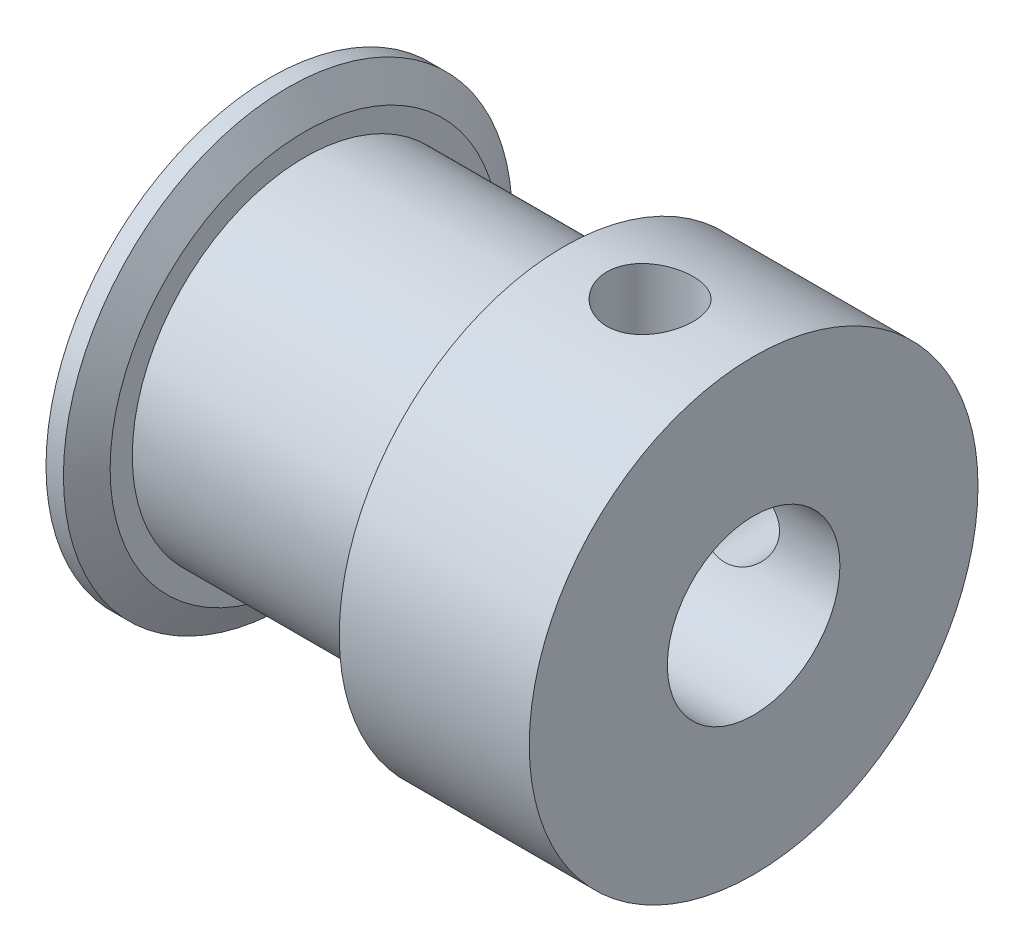
ISO-10303-21;
HEADER;
FILE_DESCRIPTION(('STEP AP214'),'2;1');
FILE_NAME('part.step','',(''),(''),'','','');
FILE_SCHEMA(('AUTOMOTIVE_DESIGN { 1 0 10303 214 1 1 1 1 }'));
ENDSEC;
DATA;
#1=APPLICATION_CONTEXT('core data for automotive mechanical design processes');
#2=APPLICATION_PROTOCOL_DEFINITION('international standard','automotive_design',2000,#1);
#3=PRODUCT_CONTEXT('',#1,'mechanical');
#4=PRODUCT('Part','Part','',(#3));
#5=PRODUCT_RELATED_PRODUCT_CATEGORY('part','',(#4));
#6=PRODUCT_DEFINITION_FORMATION('','',#4);
#7=PRODUCT_DEFINITION_CONTEXT('part definition',#1,'design');
#8=PRODUCT_DEFINITION('design','',#6,#7);
#9=PRODUCT_DEFINITION_SHAPE('','',#8);
#10=(LENGTH_UNIT() NAMED_UNIT(*) SI_UNIT(.MILLI.,.METRE.));
#11=(NAMED_UNIT(*) PLANE_ANGLE_UNIT() SI_UNIT($,.RADIAN.));
#12=(NAMED_UNIT(*) SI_UNIT($,.STERADIAN.) SOLID_ANGLE_UNIT());
#13=UNCERTAINTY_MEASURE_WITH_UNIT(LENGTH_MEASURE(1.E-05),#10,'distance_accuracy_value','');
#14=(GEOMETRIC_REPRESENTATION_CONTEXT(3) GLOBAL_UNCERTAINTY_ASSIGNED_CONTEXT((#13)) GLOBAL_UNIT_ASSIGNED_CONTEXT((#10,
#11,#12)) REPRESENTATION_CONTEXT('',''));
#15=CARTESIAN_POINT('',(0.,0.,0.));
#16=DIRECTION('',(0.,0.,1.));
#17=DIRECTION('',(1.,0.,0.));
#18=AXIS2_PLACEMENT_3D('',#15,#16,#17);
#19=CARTESIAN_POINT('',(0.,0.,-6.5));
#20=DIRECTION('',(1.,0.,0.));
#21=DIRECTION('',(0.,0.,-1.));
#22=AXIS2_PLACEMENT_3D('',#19,#20,#21);
#23=PLANE('',#22);
#24=CARTESIAN_POINT('',(0.,0.,0.));
#25=DIRECTION('',(-1.,0.,0.));
#26=DIRECTION('',(0.,0.,1.));
#27=AXIS2_PLACEMENT_3D('',#24,#25,#26);
#28=CIRCLE('',#27,2.5);
#29=CARTESIAN_POINT('',(0.,0.,2.5));
#30=VERTEX_POINT('',#29);
#31=EDGE_CURVE('E10',#30,#30,#28,.T.);
#32=ORIENTED_EDGE('',*,*,#31,.F.);
#33=EDGE_LOOP('',(#32));
#34=FACE_BOUND('',#33,.T.);
#35=CARTESIAN_POINT('',(0.,0.,0.));
#36=DIRECTION('',(-1.,0.,0.));
#37=DIRECTION('',(0.,0.,1.));
#38=AXIS2_PLACEMENT_3D('',#35,#36,#37);
#39=CIRCLE('',#38,6.5);
#40=CARTESIAN_POINT('',(0.,0.,6.5));
#41=VERTEX_POINT('',#40);
#42=EDGE_CURVE('E68',#41,#41,#39,.T.);
#43=ORIENTED_EDGE('',*,*,#42,.T.);
#44=EDGE_LOOP('',(#43));
#45=FACE_BOUND('',#44,.T.);
#46=ADVANCED_FACE('F34',(#34,#45),#23,.F.);
#47=CARTESIAN_POINT('',(-10.793334545725,0.,0.));
#48=DIRECTION('',(-1.,0.,0.));
#49=DIRECTION('',(0.,0.,1.));
#50=AXIS2_PLACEMENT_3D('',#47,#48,#49);
#51=CYLINDRICAL_SURFACE('',#50,2.5);
#52=CARTESIAN_POINT('',(11.,1.24999999999999,-2.1650635094611));
#53=CARTESIAN_POINT('',(11.0651347602441,1.24999545384315,-2.16506918410575));
#54=CARTESIAN_POINT('',(11.1303517644063,1.24487496341651,-2.16804751484696));
#55=CARTESIAN_POINT('',(11.2587840808464,1.22465401237255,-2.17952958065066));
#56=CARTESIAN_POINT('',(11.3219948938043,1.20953258069271,-2.1880449256945));
#57=CARTESIAN_POINT('',(11.4443145804299,1.17012493587475,-2.20936683256749));
#58=CARTESIAN_POINT('',(11.503443315592,1.14588744061715,-2.22215054341566));
#59=CARTESIAN_POINT('',(11.6167802524959,1.08908440672045,-2.25053331021073));
#60=CARTESIAN_POINT('',(11.6709881878281,1.0565184175447,-2.26613251845081));
#61=CARTESIAN_POINT('',(11.7778821606969,0.980833175663585,-2.29996086321802));
#62=CARTESIAN_POINT('',(11.8300739195919,0.9370650451797,-2.31830079547442));
#63=CARTESIAN_POINT('',(11.9267604855084,0.841567259518073,-2.35464978482132));
#64=CARTESIAN_POINT('',(11.9712514532294,0.789833657227853,-2.37265867289063));
#65=CARTESIAN_POINT('',(12.0542089389346,0.67561195426817,-2.40776846191187));
#66=CARTESIAN_POINT('',(12.0920672098244,0.612633986265706,-2.42472633022716));
#67=CARTESIAN_POINT('',(12.1564260665572,0.480196283249368,-2.45438445124411));
#68=CARTESIAN_POINT('',(12.1829338201715,0.410740672672683,-2.46708738979677));
#69=CARTESIAN_POINT('',(12.2218808266264,0.272556179907461,-2.48600576555297));
#70=CARTESIAN_POINT('',(12.2351869079444,0.204127238111012,-2.49261850276115));
#71=CARTESIAN_POINT('',(12.2502076483438,0.0657132858723012,-2.50009479807584));
#72=CARTESIAN_POINT('',(12.2519293209946,-0.00427075730468185,-2.50096183480737));
#73=CARTESIAN_POINT('',(12.2440666575371,-0.137290655529696,-2.49703727395563));
#74=CARTESIAN_POINT('',(12.2354524805985,-0.200401498970997,-2.492731198652));
#75=CARTESIAN_POINT('',(12.2088989451192,-0.32414221489791,-2.47967806574684));
#76=CARTESIAN_POINT('',(12.1909588887797,-0.384771901367414,-2.47093067582992));
#77=CARTESIAN_POINT('',(12.1461467923877,-0.502886739461948,-2.44964479109568));
#78=CARTESIAN_POINT('',(12.1191546085349,-0.560316779393979,-2.43705551911499));
#79=CARTESIAN_POINT('',(12.0571707297481,-0.669971001891666,-2.40922057483359));
#80=CARTESIAN_POINT('',(12.0221761708721,-0.722193311048312,-2.39397395196855));
#81=CARTESIAN_POINT('',(11.9413808105837,-0.825217076122748,-2.36055492999036));
#82=CARTESIAN_POINT('',(11.8948712145925,-0.875417593786705,-2.34224219997719));
#83=CARTESIAN_POINT('',(11.7942628438373,-0.967630462872229,-2.30567925733514));
#84=CARTESIAN_POINT('',(11.7401582846574,-1.00963651446779,-2.28742910332036));
#85=CARTESIAN_POINT('',(11.6216897594699,-1.08688166830277,-2.25180195115606));
#86=CARTESIAN_POINT('',(11.5568924711822,-1.12152164372257,-2.23455399988384));
#87=CARTESIAN_POINT('',(11.4213279108012,-1.17914889125154,-2.2046931284822));
#88=CARTESIAN_POINT('',(11.350566958728,-1.20214832276361,-2.19207537557584));
#89=CARTESIAN_POINT('',(11.2109818608965,-1.2339752637813,-2.17430794771293));
#90=CARTESIAN_POINT('',(11.1424486011956,-1.24378140264997,-2.1686456981062));
#91=CARTESIAN_POINT('',(11.0044983231043,-1.25189618326428,-2.16397399202012));
#92=CARTESIAN_POINT('',(10.9350819636003,-1.25021294664378,-2.16495983611639));
#93=CARTESIAN_POINT('',(10.8054326017766,-1.23629505417996,-2.17292920675731));
#94=CARTESIAN_POINT('',(10.7450256861151,-1.22523477089058,-2.17924484383318));
#95=CARTESIAN_POINT('',(10.6270402671613,-1.19462035579055,-2.19617526939176));
#96=CARTESIAN_POINT('',(10.5694626865667,-1.17506347327952,-2.20679145006292));
#97=CARTESIAN_POINT('',(10.4557358363716,-1.12705948575611,-2.23170277599571));
#98=CARTESIAN_POINT('',(10.3997762289331,-1.09824257961591,-2.24614554053829));
#99=CARTESIAN_POINT('',(10.2931634105763,-1.03285883001976,-2.27695149371562));
#100=CARTESIAN_POINT('',(10.2425129456084,-0.996288005415271,-2.29331566693934));
#101=CARTESIAN_POINT('',(10.1412765405956,-0.911046458998568,-2.3285999807042));
#102=CARTESIAN_POINT('',(10.0915035616029,-0.86143159039371,-2.34758228942861));
#103=CARTESIAN_POINT('',(10.000734702508,-0.754255619247864,-2.38417793722365));
#104=CARTESIAN_POINT('',(9.95974178721183,-0.696691843319187,-2.40179081259636));
#105=CARTESIAN_POINT('',(9.88678284256238,-0.573169203198451,-2.43426702113696));
#106=CARTESIAN_POINT('',(9.85508360223637,-0.507028871967646,-2.44904552090036));
#107=CARTESIAN_POINT('',(9.80357762017826,-0.369402955801357,-2.47354193699126));
#108=CARTESIAN_POINT('',(9.78376043579212,-0.297922126740225,-2.48326429595466));
#109=CARTESIAN_POINT('',(9.75828929478168,-0.158724602913027,-2.49584385227353));
#110=CARTESIAN_POINT('',(9.75150265515486,-0.0912643048130772,-2.49924909885239));
#111=CARTESIAN_POINT('',(9.748945918182,0.0439074824389978,-2.50052662968914));
#112=CARTESIAN_POINT('',(9.75317196434555,0.111618875368852,-2.49840085083612));
#113=CARTESIAN_POINT('',(9.77177050849454,0.240672490396426,-2.48917461047403));
#114=CARTESIAN_POINT('',(9.7854560615721,0.302140397264072,-2.48241118334987));
#115=CARTESIAN_POINT('',(9.82165874912872,0.421807440229514,-2.46490117079279));
#116=CARTESIAN_POINT('',(9.84417715011682,0.480006106194378,-2.45415401415995));
#117=CARTESIAN_POINT('',(9.89840881520747,0.594279257806097,-2.4290741343515));
#118=CARTESIAN_POINT('',(9.9304741540098,0.650156428375048,-2.41460771498499));
#119=CARTESIAN_POINT('',(10.0024474135738,0.75596830226752,-2.38360166427283));
#120=CARTESIAN_POINT('',(10.0423589363946,0.805900259268624,-2.36706108197951));
#121=CARTESIAN_POINT('',(10.1334964237784,0.903642505196104,-2.33160762783285));
#122=CARTESIAN_POINT('',(10.1854531093465,0.950747105674079,-2.31262248764623));
#123=CARTESIAN_POINT('',(10.2968134014122,1.03582910924333,-2.27578845203566));
#124=CARTESIAN_POINT('',(10.3562235260846,1.07379843751256,-2.25794057202332));
#125=CARTESIAN_POINT('',(10.4832958082262,1.14053884973206,-2.22499506631146));
#126=CARTESIAN_POINT('',(10.5511594139109,1.16898133245116,-2.21000217820338));
#127=CARTESIAN_POINT('',(10.6916655054247,1.213598386883,-2.1858269541044));
#128=CARTESIAN_POINT('',(10.7642911111409,1.22981398896917,-2.17662520184628));
#129=CARTESIAN_POINT('',(10.864756694565,1.2429587598305,-2.16911590752239));
#130=CARTESIAN_POINT('',(10.8917098679974,1.2455951312048,-2.1676016125644));
#131=CARTESIAN_POINT('',(10.9457706008528,1.24911675636244,-2.16557419859688));
#132=CARTESIAN_POINT('',(10.9728781704823,1.25000189299983,-2.16506114656387));
#133=CARTESIAN_POINT('',(11.,1.24999999999999,-2.1650635094611));
#134=B_SPLINE_CURVE_WITH_KNOTS('',3,(#52,#53,#54,#55,#56,#57,#58,#59,#60,#61,#62,#63,#64,#65,
#66,#67,#68,#69,#70,#71,#72,#73,#74,#75,#76,#77,#78,#79,#80,#81,#82,#83,#84,#85,#86,#87,#88,#89,
#90,#91,#92,#93,#94,#95,#96,#97,#98,#99,#100,#101,#102,#103,#104,#105,#106,#107,#108,#109,#110,
#111,#112,#113,#114,#115,#116,#117,#118,#119,#120,#121,#122,#123,#124,#125,#126,#127,#128,#129,
#130,#131,#132,#133),.UNSPECIFIED.,.T.,.F.,(4,2,2,2,2,2,2,2,2,2,2,2,2,2,2,2,2,2,2,2,2,2,2,2,2,2,
2,2,2,2,2,2,2,2,2,2,2,2,2,2,4),(0.,0.195290153243394,0.390991116031004,0.585660744898603,
0.780340906806433,0.991077890622786,1.20191963855463,1.42697365298454,1.65188533704863,
1.86079356209918,2.06957529607549,2.26020121855672,2.45084140646818,2.64411918413932,
2.83746624187838,3.04908989321112,3.26087560307397,3.48611052161809,3.71110967764629,
3.91827863567763,4.12530116485464,4.3096772928003,4.49411315545077,4.68709120507607,
4.88016857775057,5.09758429475764,5.3150733122275,5.53830226766204,5.76133474760961,
5.96390337986855,6.16640108492461,6.35555531089362,6.54473666890013,6.74200938399336,
6.93937287625895,7.15637802312581,7.37357428556439,7.59763436298252,7.82093916253446,
7.90225168981632,7.98356965618171),.UNSPECIFIED.);
#135=CARTESIAN_POINT('',(11.,1.24999999999999,-2.1650635094611));
#136=VERTEX_POINT('',#135);
#137=EDGE_CURVE('E154',#136,#136,#134,.T.);
#138=ORIENTED_EDGE('',*,*,#137,.T.);
#139=EDGE_LOOP('',(#138));
#140=FACE_BOUND('',#139,.T.);
#141=CARTESIAN_POINT('',(11.,2.1650635094611,1.24999999999999));
#142=CARTESIAN_POINT('',(11.0651347602441,2.16506918410574,1.24999545384316));
#143=CARTESIAN_POINT('',(11.1303517644063,2.16804751484696,1.24487496341651));
#144=CARTESIAN_POINT('',(11.2587840808464,2.17952958065066,1.22465401237256));
#145=CARTESIAN_POINT('',(11.3219948938043,2.1880449256945,1.20953258069272));
#146=CARTESIAN_POINT('',(11.4443145804299,2.20936683256748,1.17012493587476));
#147=CARTESIAN_POINT('',(11.503443315592,2.22215054341565,1.14588744061716));
#148=CARTESIAN_POINT('',(11.6167802524959,2.25053331021073,1.08908440672046));
#149=CARTESIAN_POINT('',(11.6709881878281,2.26613251845081,1.05651841754471));
#150=CARTESIAN_POINT('',(11.7778821606969,2.29996086321802,0.980833175663593));
#151=CARTESIAN_POINT('',(11.8300739195919,2.31830079547442,0.937065045179708));
#152=CARTESIAN_POINT('',(11.9267604855084,2.35464978482132,0.841567259518081));
#153=CARTESIAN_POINT('',(11.9712514532294,2.37265867289062,0.789833657227862));
#154=CARTESIAN_POINT('',(12.0542089389346,2.40776846191186,0.675611954268179));
#155=CARTESIAN_POINT('',(12.0920672098244,2.42472633022716,0.612633986265716));
#156=CARTESIAN_POINT('',(12.1564260665572,2.45438445124411,0.480196283249379));
#157=CARTESIAN_POINT('',(12.1829338201715,2.46708738979677,0.410740672672693));
#158=CARTESIAN_POINT('',(12.2218808266264,2.48600576555297,0.272556179907471));
#159=CARTESIAN_POINT('',(12.2351869079444,2.49261850276115,0.204127238111022));
#160=CARTESIAN_POINT('',(12.2502076483438,2.50009479807584,0.0657132858723103));
#161=CARTESIAN_POINT('',(12.2519293209946,2.50096183480737,-0.00427075730467276));
#162=CARTESIAN_POINT('',(12.2440666575371,2.49703727395563,-0.137290655529687));
#163=CARTESIAN_POINT('',(12.2354524805985,2.492731198652,-0.200401498970988));
#164=CARTESIAN_POINT('',(12.2088989451192,2.47967806574684,-0.324142214897901));
#165=CARTESIAN_POINT('',(12.1909588887797,2.47093067582992,-0.384771901367405));
#166=CARTESIAN_POINT('',(12.1461467923877,2.44964479109568,-0.50288673946194));
#167=CARTESIAN_POINT('',(12.1191546085349,2.43705551911499,-0.560316779393971));
#168=CARTESIAN_POINT('',(12.0571707297481,2.40922057483359,-0.669971001891658));
#169=CARTESIAN_POINT('',(12.0221761708721,2.39397395196855,-0.722193311048304));
#170=CARTESIAN_POINT('',(11.9413808105837,2.36055492999037,-0.825217076122739));
#171=CARTESIAN_POINT('',(11.8948712145925,2.34224219997719,-0.875417593786696));
#172=CARTESIAN_POINT('',(11.7942628438373,2.30567925733515,-0.96763046287222));
#173=CARTESIAN_POINT('',(11.7401582846574,2.28742910332036,-1.00963651446778));
#174=CARTESIAN_POINT('',(11.6216897594699,2.25180195115606,-1.08688166830276));
#175=CARTESIAN_POINT('',(11.5568924711822,2.23455399988385,-1.12152164372256));
#176=CARTESIAN_POINT('',(11.4213279108012,2.2046931284822,-1.17914889125153));
#177=CARTESIAN_POINT('',(11.350566958728,2.19207537557585,-1.20214832276361));
#178=CARTESIAN_POINT('',(11.2109818608965,2.17430794771293,-1.23397526378129));
#179=CARTESIAN_POINT('',(11.1424486011956,2.16864569810621,-1.24378140264996));
#180=CARTESIAN_POINT('',(11.0044983231043,2.16397399202012,-1.25189618326427));
#181=CARTESIAN_POINT('',(10.9350819636003,2.1649598361164,-1.25021294664377));
#182=CARTESIAN_POINT('',(10.8054326017766,2.17292920675731,-1.23629505417995));
#183=CARTESIAN_POINT('',(10.7450256861151,2.17924484383318,-1.22523477089058));
#184=CARTESIAN_POINT('',(10.6270402671613,2.19617526939177,-1.19462035579054));
#185=CARTESIAN_POINT('',(10.5694626865667,2.20679145006293,-1.17506347327951));
#186=CARTESIAN_POINT('',(10.4557358363716,2.23170277599571,-1.1270594857561));
#187=CARTESIAN_POINT('',(10.3997762289331,2.24614554053829,-1.0982425796159));
#188=CARTESIAN_POINT('',(10.2931634105763,2.27695149371562,-1.03285883001975));
#189=CARTESIAN_POINT('',(10.2425129456084,2.29331566693935,-0.996288005415262));
#190=CARTESIAN_POINT('',(10.1412765405956,2.3285999807042,-0.911046458998559));
#191=CARTESIAN_POINT('',(10.0915035616029,2.34758228942862,-0.861431590393701));
#192=CARTESIAN_POINT('',(10.000734702508,2.38417793722366,-0.754255619247854));
#193=CARTESIAN_POINT('',(9.95974178721183,2.40179081259637,-0.696691843319177));
#194=CARTESIAN_POINT('',(9.88678284256238,2.43426702113696,-0.57316920319844));
#195=CARTESIAN_POINT('',(9.85508360223637,2.44904552090037,-0.507028871967635));
#196=CARTESIAN_POINT('',(9.80357762017826,2.47354193699126,-0.369402955801347));
#197=CARTESIAN_POINT('',(9.78376043579213,2.48326429595466,-0.297922126740215));
#198=CARTESIAN_POINT('',(9.75828929478168,2.49584385227353,-0.158724602913017));
#199=CARTESIAN_POINT('',(9.75150265515486,2.49924909885239,-0.091264304813067));
#200=CARTESIAN_POINT('',(9.74894591818201,2.50052662968914,0.0439074824390078));
#201=CARTESIAN_POINT('',(9.75317196434555,2.49840085083612,0.111618875368861));
#202=CARTESIAN_POINT('',(9.77177050849454,2.48917461047403,0.240672490396436));
#203=CARTESIAN_POINT('',(9.7854560615721,2.48241118334987,0.302140397264081));
#204=CARTESIAN_POINT('',(9.82165874912872,2.46490117079279,0.421807440229523));
#205=CARTESIAN_POINT('',(9.84417715011682,2.45415401415995,0.480006106194386));
#206=CARTESIAN_POINT('',(9.89840881520747,2.4290741343515,0.594279257806105));
#207=CARTESIAN_POINT('',(9.9304741540098,2.41460771498499,0.650156428375057));
#208=CARTESIAN_POINT('',(10.0024474135738,2.38360166427283,0.755968302267529));
#209=CARTESIAN_POINT('',(10.0423589363946,2.36706108197951,0.805900259268632));
#210=CARTESIAN_POINT('',(10.1334964237784,2.33160762783285,0.903642505196112));
#211=CARTESIAN_POINT('',(10.1854531093465,2.31262248764622,0.950747105674087));
#212=CARTESIAN_POINT('',(10.2968134014122,2.27578845203565,1.03582910924334));
#213=CARTESIAN_POINT('',(10.3562235260846,2.25794057202332,1.07379843751257));
#214=CARTESIAN_POINT('',(10.4832958082262,2.22499506631145,1.14053884973206));
#215=CARTESIAN_POINT('',(10.5511594139109,2.21000217820338,1.16898133245117));
#216=CARTESIAN_POINT('',(10.6916655054247,2.1858269541044,1.21359838688301));
#217=CARTESIAN_POINT('',(10.7642911111409,2.17662520184628,1.22981398896918));
#218=CARTESIAN_POINT('',(10.864756694565,2.16911590752238,1.24295875983051));
#219=CARTESIAN_POINT('',(10.8917098679974,2.1676016125644,1.24559513120481));
#220=CARTESIAN_POINT('',(10.9457706008528,2.16557419859688,1.24911675636245));
#221=CARTESIAN_POINT('',(10.9728781704823,2.16506114656387,1.25000189299983));
#222=CARTESIAN_POINT('',(11.,2.1650635094611,1.24999999999999));
#223=B_SPLINE_CURVE_WITH_KNOTS('',3,(#141,#142,#143,#144,#145,#146,#147,#148,#149,#150,#151,
#152,#153,#154,#155,#156,#157,#158,#159,#160,#161,#162,#163,#164,#165,#166,#167,#168,#169,#170,
#171,#172,#173,#174,#175,#176,#177,#178,#179,#180,#181,#182,#183,#184,#185,#186,#187,#188,#189,
#190,#191,#192,#193,#194,#195,#196,#197,#198,#199,#200,#201,#202,#203,#204,#205,#206,#207,#208,
#209,#210,#211,#212,#213,#214,#215,#216,#217,#218,#219,#220,#221,#222),.UNSPECIFIED.,.T.,.F.,(4,
2,2,2,2,2,2,2,2,2,2,2,2,2,2,2,2,2,2,2,2,2,2,2,2,2,2,2,2,2,2,2,2,2,2,2,2,2,2,2,4),(0.,
0.195290153243394,0.390991116031004,0.585660744898607,0.780340906806433,0.991077890622786,
1.20191963855463,1.42697365298453,1.65188533704863,1.86079356209918,2.06957529607549,
2.26020121855672,2.45084140646818,2.64411918413932,2.83746624187838,3.04908989321112,
3.26087560307396,3.48611052161809,3.71110967764629,3.91827863567763,4.12530116485464,
4.3096772928003,4.49411315545076,4.68709120507607,4.88016857775057,5.09758429475764,
5.3150733122275,5.53830226766204,5.76133474760961,5.96390337986855,6.16640108492461,
6.35555531089362,6.54473666890013,6.74200938399336,6.93937287625895,7.1563780231258,
7.37357428556439,7.59763436298252,7.82093916253446,7.90225168981632,7.98356965618171),.UNSPECIFIED.);
#224=CARTESIAN_POINT('',(11.,2.1650635094611,1.24999999999999));
#225=VERTEX_POINT('',#224);
#226=EDGE_CURVE('E79',#225,#225,#223,.T.);
#227=ORIENTED_EDGE('',*,*,#226,.T.);
#228=EDGE_LOOP('',(#227));
#229=FACE_BOUND('',#228,.T.);
#230=CARTESIAN_POINT('',(14.,0.,0.));
#231=DIRECTION('',(-1.,0.,0.));
#232=DIRECTION('',(0.,0.,1.));
#233=AXIS2_PLACEMENT_3D('',#230,#231,#232);
#234=CIRCLE('',#233,2.5);
#235=CARTESIAN_POINT('',(14.,0.,2.5));
#236=VERTEX_POINT('',#235);
#237=EDGE_CURVE('E40',#236,#236,#234,.T.);
#238=ORIENTED_EDGE('',*,*,#237,.F.);
#239=EDGE_LOOP('',(#238));
#240=FACE_BOUND('',#239,.T.);
#241=ORIENTED_EDGE('',*,*,#31,.T.);
#242=EDGE_LOOP('',(#241));
#243=FACE_BOUND('',#242,.T.);
#244=ADVANCED_FACE('F130',(#140,#229,#240,#243),#51,.F.);
#245=CARTESIAN_POINT('',(14.,0.,-6.5));
#246=DIRECTION('',(-1.,0.,0.));
#247=DIRECTION('',(0.,0.,1.));
#248=AXIS2_PLACEMENT_3D('',#245,#246,#247);
#249=PLANE('',#248);
#250=CARTESIAN_POINT('',(14.,0.,0.));
#251=DIRECTION('',(-1.,0.,0.));
#252=DIRECTION('',(0.,0.,1.));
#253=AXIS2_PLACEMENT_3D('',#250,#251,#252);
#254=CIRCLE('',#253,6.5);
#255=CARTESIAN_POINT('',(14.,0.,6.5));
#256=VERTEX_POINT('',#255);
#257=EDGE_CURVE('E44',#256,#256,#254,.T.);
#258=ORIENTED_EDGE('',*,*,#257,.F.);
#259=EDGE_LOOP('',(#258));
#260=FACE_BOUND('',#259,.T.);
#261=ORIENTED_EDGE('',*,*,#237,.T.);
#262=EDGE_LOOP('',(#261));
#263=FACE_BOUND('',#262,.T.);
#264=ADVANCED_FACE('F125',(#260,#263),#249,.F.);
#265=CARTESIAN_POINT('',(-10.793334545725,0.,0.));
#266=DIRECTION('',(-1.,0.,0.));
#267=DIRECTION('',(0.,0.,1.));
#268=AXIS2_PLACEMENT_3D('',#265,#266,#267);
#269=CYLINDRICAL_SURFACE('',#268,6.5);
#270=CARTESIAN_POINT('',(11.,1.24999999999997,-6.37867541108654));
#271=CARTESIAN_POINT('',(10.9304870701299,1.24999736885639,-6.37867677250477));
#272=CARTESIAN_POINT('',(10.8609403849395,1.24418186230498,-6.37982405427988));
#273=CARTESIAN_POINT('',(10.723810470586,1.22109056860368,-6.38428311706258));
#274=CARTESIAN_POINT('',(10.6562289199764,1.2038052680602,-6.38759669482778));
#275=CARTESIAN_POINT('',(10.5250331776187,1.15832687331586,-6.39599950317928));
#276=CARTESIAN_POINT('',(10.461415263085,1.13014419926352,-6.40108703704062));
#277=CARTESIAN_POINT('',(10.3398137250332,1.0636990177658,-6.41246250789304));
#278=CARTESIAN_POINT('',(10.2818297096666,1.02543721203106,-6.41875036130931));
#279=CARTESIAN_POINT('',(10.1723793937811,0.939386229111957,-6.43190989333671));
#280=CARTESIAN_POINT('',(10.1209975252457,0.891490559318406,-6.43878755510874));
#281=CARTESIAN_POINT('',(10.0269462349264,0.787761561290316,-6.45229899014005));
#282=CARTESIAN_POINT('',(9.98427739952779,0.731927699245843,-6.45893274695996));
#283=CARTESIAN_POINT('',(9.90853829487112,0.613350935538086,-6.47127318847283));
#284=CARTESIAN_POINT('',(9.87554787064748,0.550556144435054,-6.4769719992949));
#285=CARTESIAN_POINT('',(9.82061678733642,0.420187239305355,-6.48673338477553));
#286=CARTESIAN_POINT('',(9.79867517244009,0.352613539268875,-6.49079610096305));
#287=CARTESIAN_POINT('',(9.76672629824719,0.215480422586701,-6.49678527544986));
#288=CARTESIAN_POINT('',(9.75657661243997,0.145955319062528,-6.49873720804986));
#289=CARTESIAN_POINT('',(9.74805570838894,0.00616353547045933,-6.50037275588565));
#290=CARTESIAN_POINT('',(9.74968343733201,-0.0641030777512762,-6.500056573874));
#291=CARTESIAN_POINT('',(9.76456238130295,-0.202405790144951,-6.49721136164987));
#292=CARTESIAN_POINT('',(9.77766021656545,-0.27045907804485,-6.49471153255982));
#293=CARTESIAN_POINT('',(9.81486472715625,-0.40338352482687,-6.48781272689527));
#294=CARTESIAN_POINT('',(9.83897181885584,-0.468254563253192,-6.48341367849242));
#295=CARTESIAN_POINT('',(9.89765514107206,-0.593415183621947,-6.47316216290495));
#296=CARTESIAN_POINT('',(9.93229222264249,-0.653675517596723,-6.46730128437235));
#297=CARTESIAN_POINT('',(10.0110073969698,-0.767585734089813,-6.45477348931642));
#298=CARTESIAN_POINT('',(10.0550864976628,-0.821234909902577,-6.44810648677241));
#299=CARTESIAN_POINT('',(10.1522782545843,-0.92130923472024,-6.43457726746675));
#300=CARTESIAN_POINT('',(10.2055251171175,-0.967603944931744,-6.42771363640452));
#301=CARTESIAN_POINT('',(10.3190950873362,-1.05062658176581,-6.41466719987934));
#302=CARTESIAN_POINT('',(10.3794183094764,-1.08735435361945,-6.40848440543154));
#303=CARTESIAN_POINT('',(10.5056070086356,-1.15024066625938,-6.39749734332417));
#304=CARTESIAN_POINT('',(10.5714825775618,-1.1763794373028,-6.39269565900801));
#305=CARTESIAN_POINT('',(10.7068037771895,-1.21718055037066,-6.3850533836003));
#306=CARTESIAN_POINT('',(10.7762489795482,-1.23184426594896,-6.38221255780053));
#307=CARTESIAN_POINT('',(10.9155596623143,-1.24908687610469,-6.37886030689755));
#308=CARTESIAN_POINT('',(10.9854010568419,-1.25185353492833,-6.37831269303331));
#309=CARTESIAN_POINT('',(11.1245476819348,-1.24572754981922,-6.37951191542097));
#310=CARTESIAN_POINT('',(11.1938529402843,-1.23683551420127,-6.38125863196178));
#311=CARTESIAN_POINT('',(11.3293374715962,-1.20780600299424,-6.38681592650116));
#312=CARTESIAN_POINT('',(11.3955388020833,-1.18776767337308,-6.39060829956574));
#313=CARTESIAN_POINT('',(11.5236444237273,-1.13711989327066,-6.39981381261965));
#314=CARTESIAN_POINT('',(11.5855483835179,-1.10650962868253,-6.40522707742377));
#315=CARTESIAN_POINT('',(11.7041271211925,-1.03515742955886,-6.41714642685596));
#316=CARTESIAN_POINT('',(11.7607295072189,-0.994297306141371,-6.42366494996723));
#317=CARTESIAN_POINT('',(11.866342559433,-0.90376393894118,-6.43702568121476));
#318=CARTESIAN_POINT('',(11.9153525050736,-0.854089859644106,-6.44386791999234));
#319=CARTESIAN_POINT('',(12.0050948760167,-0.746498406265088,-6.45722186414506));
#320=CARTESIAN_POINT('',(12.0457007660287,-0.68847462176834,-6.46372754443459));
#321=CARTESIAN_POINT('',(12.1165876530475,-0.566319701133056,-6.47557271520352));
#322=CARTESIAN_POINT('',(12.1468690616983,-0.502188808619503,-6.48091225217478));
#323=CARTESIAN_POINT('',(12.1960598649178,-0.369983306850273,-6.48979767344294));
#324=CARTESIAN_POINT('',(12.2150304053231,-0.301932124206317,-6.49335318520434));
#325=CARTESIAN_POINT('',(12.2412555973101,-0.163534387521089,-6.49831110108714));
#326=CARTESIAN_POINT('',(12.2485115486984,-0.0931880890209875,-6.4997137440819));
#327=CARTESIAN_POINT('',(12.2510544157463,0.0465913760590636,-6.50020279357526));
#328=CARTESIAN_POINT('',(12.2465321111651,0.116021014310155,-6.49932611998711));
#329=CARTESIAN_POINT('',(12.2260659599172,0.253111453624531,-6.49543210097589));
#330=CARTESIAN_POINT('',(12.2101222352329,0.320772273571049,-6.49241477841525));
#331=CARTESIAN_POINT('',(12.1673479038059,0.452296774627162,-6.48457887372446));
#332=CARTESIAN_POINT('',(12.140538595824,0.516167605689429,-6.47976381696689));
#333=CARTESIAN_POINT('',(12.0768174427467,0.638532441229185,-6.468852626646));
#334=CARTESIAN_POINT('',(12.039904874214,0.697026060274173,-6.46275640135273));
#335=CARTESIAN_POINT('',(11.9563732748342,0.807923978838708,-6.44983924026474));
#336=CARTESIAN_POINT('',(11.9096169139576,0.86022374245002,-6.44300880304229));
#337=CARTESIAN_POINT('',(11.808008908723,0.956300833059333,-6.42945166376516));
#338=CARTESIAN_POINT('',(11.7531553586733,1.00007614816925,-6.42272498654338));
#339=CARTESIAN_POINT('',(11.6362650805111,1.07826726211676,-6.41006461317975));
#340=CARTESIAN_POINT('',(11.5741631204958,1.11258695800965,-6.40413935016888));
#341=CARTESIAN_POINT('',(11.4449796130776,1.1702507721629,-6.39385470831481));
#342=CARTESIAN_POINT('',(11.3779027648172,1.19360509889591,-6.38949387392551));
#343=CARTESIAN_POINT('',(11.2588708126346,1.22401068110329,-6.38372654797567));
#344=CARTESIAN_POINT('',(11.2076060062007,1.23373969739609,-6.38184380422201));
#345=CARTESIAN_POINT('',(11.1042337768284,1.24673524699075,-6.37931774381065));
#346=CARTESIAN_POINT('',(11.0521263790688,1.2500019730428,-6.37867439018579));
#347=CARTESIAN_POINT('',(11.,1.24999999999997,-6.37867541108654));
#348=B_SPLINE_CURVE_WITH_KNOTS('',3,(#270,#271,#272,#273,#274,#275,#276,#277,#278,#279,#280,
#281,#282,#283,#284,#285,#286,#287,#288,#289,#290,#291,#292,#293,#294,#295,#296,#297,#298,#299,
#300,#301,#302,#303,#304,#305,#306,#307,#308,#309,#310,#311,#312,#313,#314,#315,#316,#317,#318,
#319,#320,#321,#322,#323,#324,#325,#326,#327,#328,#329,#330,#331,#332,#333,#334,#335,#336,#337,
#338,#339,#340,#341,#342,#343,#344,#345,#346,#347),.UNSPECIFIED.,.T.,.F.,(4,2,2,2,2,2,2,2,2,2,2,
2,2,2,2,2,2,2,2,2,2,2,2,2,2,2,2,2,2,2,2,2,2,2,2,2,2,2,4),(0.,0.208347994425063,
0.416869015339831,0.625191138043341,0.833498761161481,1.04424985912791,1.25501513592546,
1.46747321088402,1.67991290338877,1.88975909537703,2.09958652891118,2.30665024511141,
2.51372179313299,2.72201348359887,2.9303274203089,3.14200045966174,3.35367692313737,
3.56574678669523,3.77779126179575,3.98647658946276,4.19515102900507,4.4019983304366,
4.60886156399132,4.8182295460239,5.02761738559909,5.23995929713471,5.45229274146443,
5.66346766485099,5.87461915545402,6.08237184297276,6.29012231169611,6.49746750164922,
6.70482754230234,6.91529891011168,7.12581989203799,7.33840759539414,7.55079699078512,
7.70703771468343,7.86327377833242),.UNSPECIFIED.);
#349=CARTESIAN_POINT('',(11.,1.24999999999997,-6.37867541108654));
#350=VERTEX_POINT('',#349);
#351=EDGE_CURVE('E158',#350,#350,#348,.T.);
#352=ORIENTED_EDGE('',*,*,#351,.T.);
#353=EDGE_LOOP('',(#352));
#354=FACE_BOUND('',#353,.T.);
#355=CARTESIAN_POINT('',(11.,6.37867541108654,1.24999999999999));
#356=CARTESIAN_POINT('',(10.9304870701299,6.37867677250476,1.24999736885641));
#357=CARTESIAN_POINT('',(10.8609403849395,6.37982405427988,1.244181862305));
#358=CARTESIAN_POINT('',(10.723810470586,6.38428311706257,1.2210905686037));
#359=CARTESIAN_POINT('',(10.6562289199764,6.38759669482778,1.20380526806022));
#360=CARTESIAN_POINT('',(10.5250331776187,6.39599950317928,1.15832687331588));
#361=CARTESIAN_POINT('',(10.461415263085,6.40108703704062,1.13014419926354));
#362=CARTESIAN_POINT('',(10.3398137250332,6.41246250789304,1.06369901776582));
#363=CARTESIAN_POINT('',(10.2818297096666,6.41875036130931,1.02543721203108));
#364=CARTESIAN_POINT('',(10.1723793937811,6.43190989333671,0.93938622911198));
#365=CARTESIAN_POINT('',(10.1209975252457,6.43878755510874,0.891490559318429));
#366=CARTESIAN_POINT('',(10.0269462349264,6.45229899014005,0.78776156129034));
#367=CARTESIAN_POINT('',(9.9842773995278,6.45893274695996,0.731927699245867));
#368=CARTESIAN_POINT('',(9.90853829487112,6.47127318847283,0.61335093553811));
#369=CARTESIAN_POINT('',(9.87554787064748,6.4769719992949,0.550556144435078));
#370=CARTESIAN_POINT('',(9.82061678733643,6.48673338477552,0.42018723930538));
#371=CARTESIAN_POINT('',(9.79867517244009,6.49079610096305,0.352613539268899));
#372=CARTESIAN_POINT('',(9.7667262982472,6.49678527544986,0.215480422586725));
#373=CARTESIAN_POINT('',(9.75657661243998,6.49873720804986,0.145955319062553));
#374=CARTESIAN_POINT('',(9.74805570838894,6.50037275588565,0.00616353547048378));
#375=CARTESIAN_POINT('',(9.749683437332,6.500056573874,-0.0641030777512518));
#376=CARTESIAN_POINT('',(9.76456238130295,6.49721136164987,-0.202405790144926));
#377=CARTESIAN_POINT('',(9.77766021656545,6.49471153255983,-0.270459078044826));
#378=CARTESIAN_POINT('',(9.81486472715625,6.48781272689528,-0.403383524826845));
#379=CARTESIAN_POINT('',(9.83897181885584,6.48341367849243,-0.468254563253168));
#380=CARTESIAN_POINT('',(9.89765514107206,6.47316216290495,-0.593415183621923));
#381=CARTESIAN_POINT('',(9.93229222264249,6.46730128437235,-0.653675517596699));
#382=CARTESIAN_POINT('',(10.0110073969698,6.45477348931643,-0.767585734089789));
#383=CARTESIAN_POINT('',(10.0550864976628,6.44810648677241,-0.821234909902552));
#384=CARTESIAN_POINT('',(10.1522782545843,6.43457726746675,-0.921309234720216));
#385=CARTESIAN_POINT('',(10.2055251171175,6.42771363640452,-0.967603944931721));
#386=CARTESIAN_POINT('',(10.3190950873362,6.41466719987934,-1.05062658176578));
#387=CARTESIAN_POINT('',(10.3794183094764,6.40848440543154,-1.08735435361943));
#388=CARTESIAN_POINT('',(10.5056070086356,6.39749734332418,-1.15024066625936));
#389=CARTESIAN_POINT('',(10.5714825775618,6.39269565900802,-1.17637943730278));
#390=CARTESIAN_POINT('',(10.7068037771895,6.3850533836003,-1.21718055037064));
#391=CARTESIAN_POINT('',(10.7762489795482,6.38221255780053,-1.23184426594894));
#392=CARTESIAN_POINT('',(10.9155596623143,6.37886030689755,-1.24908687610467));
#393=CARTESIAN_POINT('',(10.9854010568419,6.37831269303331,-1.25185353492831));
#394=CARTESIAN_POINT('',(11.1245476819348,6.37951191542098,-1.2457275498192));
#395=CARTESIAN_POINT('',(11.1938529402843,6.38125863196178,-1.23683551420124));
#396=CARTESIAN_POINT('',(11.3293374715962,6.38681592650117,-1.20780600299422));
#397=CARTESIAN_POINT('',(11.3955388020833,6.39060829956575,-1.18776767337306));
#398=CARTESIAN_POINT('',(11.5236444237273,6.39981381261965,-1.13711989327064));
#399=CARTESIAN_POINT('',(11.5855483835179,6.40522707742377,-1.1065096286825));
#400=CARTESIAN_POINT('',(11.7041271211925,6.41714642685596,-1.03515742955883));
#401=CARTESIAN_POINT('',(11.7607295072189,6.42366494996723,-0.994297306141348));
#402=CARTESIAN_POINT('',(11.866342559433,6.43702568121476,-0.903763938941158));
#403=CARTESIAN_POINT('',(11.9153525050736,6.44386791999234,-0.854089859644083));
#404=CARTESIAN_POINT('',(12.0050948760167,6.45722186414506,-0.746498406265066));
#405=CARTESIAN_POINT('',(12.0457007660287,6.4637275444346,-0.688474621768318));
#406=CARTESIAN_POINT('',(12.1165876530475,6.47557271520352,-0.566319701133033));
#407=CARTESIAN_POINT('',(12.1468690616983,6.48091225217478,-0.50218880861948));
#408=CARTESIAN_POINT('',(12.1960598649178,6.48979767344294,-0.36998330685025));
#409=CARTESIAN_POINT('',(12.2150304053231,6.49335318520434,-0.301932124206295));
#410=CARTESIAN_POINT('',(12.2412555973101,6.49831110108714,-0.163534387521067));
#411=CARTESIAN_POINT('',(12.2485115486984,6.4997137440819,-0.0931880890209663));
#412=CARTESIAN_POINT('',(12.2510544157463,6.50020279357526,0.0465913760590845));
#413=CARTESIAN_POINT('',(12.2465321111651,6.49932611998711,0.116021014310175));
#414=CARTESIAN_POINT('',(12.2260659599172,6.49543210097589,0.253111453624551));
#415=CARTESIAN_POINT('',(12.2101222352329,6.49241477841525,0.320772273571069));
#416=CARTESIAN_POINT('',(12.1673479038059,6.48457887372446,0.452296774627182));
#417=CARTESIAN_POINT('',(12.140538595824,6.47976381696689,0.516167605689451));
#418=CARTESIAN_POINT('',(12.0768174427467,6.468852626646,0.638532441229207));
#419=CARTESIAN_POINT('',(12.039904874214,6.46275640135272,0.697026060274194));
#420=CARTESIAN_POINT('',(11.9563732748342,6.44983924026474,0.807923978838729));
#421=CARTESIAN_POINT('',(11.9096169139576,6.44300880304229,0.860223742450042));
#422=CARTESIAN_POINT('',(11.808008908723,6.42945166376516,0.956300833059354));
#423=CARTESIAN_POINT('',(11.7531553586733,6.42272498654338,1.00007614816927));
#424=CARTESIAN_POINT('',(11.6362650805111,6.41006461317974,1.07826726211679));
#425=CARTESIAN_POINT('',(11.5741631204959,6.40413935016887,1.11258695800967));
#426=CARTESIAN_POINT('',(11.4449796130776,6.39385470831481,1.17025077216292));
#427=CARTESIAN_POINT('',(11.3779027648172,6.38949387392551,1.19360509889593));
#428=CARTESIAN_POINT('',(11.2588708126346,6.38372654797567,1.22401068110331));
#429=CARTESIAN_POINT('',(11.2076060062007,6.381843804222,1.23373969739611));
#430=CARTESIAN_POINT('',(11.1042337768284,6.37931774381065,1.24673524699077));
#431=CARTESIAN_POINT('',(11.0521263790688,6.37867439018579,1.25000197304282));
#432=CARTESIAN_POINT('',(11.,6.37867541108654,1.24999999999999));
#433=B_SPLINE_CURVE_WITH_KNOTS('',3,(#355,#356,#357,#358,#359,#360,#361,#362,#363,#364,#365,
#366,#367,#368,#369,#370,#371,#372,#373,#374,#375,#376,#377,#378,#379,#380,#381,#382,#383,#384,
#385,#386,#387,#388,#389,#390,#391,#392,#393,#394,#395,#396,#397,#398,#399,#400,#401,#402,#403,
#404,#405,#406,#407,#408,#409,#410,#411,#412,#413,#414,#415,#416,#417,#418,#419,#420,#421,#422,
#423,#424,#425,#426,#427,#428,#429,#430,#431,#432),.UNSPECIFIED.,.T.,.F.,(4,2,2,2,2,2,2,2,2,2,2,
2,2,2,2,2,2,2,2,2,2,2,2,2,2,2,2,2,2,2,2,2,2,2,2,2,2,2,4),(0.,0.208347994425063,0.41686901533983,
0.625191138043341,0.833498761161478,1.04424985912791,1.25501513592545,1.46747321088401,
1.67991290338877,1.88975909537703,2.09958652891117,2.3066502451114,2.51372179313299,
2.72201348359886,2.93032742030889,3.14200045966174,3.35367692313736,3.56574678669523,
3.77779126179575,3.98647658946276,4.19515102900506,4.40199833043659,4.60886156399132,
4.8182295460239,5.02761738559908,5.2399592971347,5.45229274146443,5.66346766485098,
5.87461915545401,6.08237184297275,6.2901223116961,6.49746750164921,6.70482754230233,
6.91529891011167,7.12581989203798,7.33840759539413,7.5507969907851,7.70703771468342,
7.86327377833241),.UNSPECIFIED.);
#434=CARTESIAN_POINT('',(11.,6.37867541108654,1.24999999999999));
#435=VERTEX_POINT('',#434);
#436=EDGE_CURVE('E71',#435,#435,#433,.T.);
#437=ORIENTED_EDGE('',*,*,#436,.T.);
#438=EDGE_LOOP('',(#437));
#439=FACE_BOUND('',#438,.T.);
#440=CARTESIAN_POINT('',(8.49532543403975,0.,0.));
#441=DIRECTION('',(-1.,0.,0.));
#442=DIRECTION('',(0.,0.,1.));
#443=AXIS2_PLACEMENT_3D('',#440,#441,#442);
#444=CIRCLE('',#443,6.5);
#445=CARTESIAN_POINT('',(8.49532543403975,0.,6.5));
#446=VERTEX_POINT('',#445);
#447=EDGE_CURVE('E48',#446,#446,#444,.T.);
#448=ORIENTED_EDGE('',*,*,#447,.F.);
#449=EDGE_LOOP('',(#448));
#450=FACE_BOUND('',#449,.T.);
#451=ORIENTED_EDGE('',*,*,#257,.T.);
#452=EDGE_LOOP('',(#451));
#453=FACE_BOUND('',#452,.T.);
#454=ADVANCED_FACE('F85',(#354,#439,#450,#453),#269,.T.);
#455=CARTESIAN_POINT('',(8.49532543403975,0.,0.));
#456=DIRECTION('',(1.,0.,0.));
#457=DIRECTION('',(0.,0.,-1.));
#458=AXIS2_PLACEMENT_3D('',#455,#456,#457);
#459=CONICAL_SURFACE('',#458,6.5,1.0471975511966);
#460=CARTESIAN_POINT('',(8.,0.,0.));
#461=DIRECTION('',(-1.,0.,0.));
#462=DIRECTION('',(0.,0.,1.));
#463=AXIS2_PLACEMENT_3D('',#460,#461,#462);
#464=CIRCLE('',#463,5.64207118196205);
#465=CARTESIAN_POINT('',(8.,0.,5.64207118196205));
#466=VERTEX_POINT('',#465);
#467=EDGE_CURVE('E53',#466,#466,#464,.T.);
#468=ORIENTED_EDGE('',*,*,#467,.F.);
#469=EDGE_LOOP('',(#468));
#470=FACE_BOUND('',#469,.T.);
#471=ORIENTED_EDGE('',*,*,#447,.T.);
#472=EDGE_LOOP('',(#471));
#473=FACE_BOUND('',#472,.T.);
#474=ADVANCED_FACE('F118',(#470,#473),#459,.T.);
#475=CARTESIAN_POINT('',(8.,0.,-5.));
#476=DIRECTION('',(1.,0.,0.));
#477=DIRECTION('',(0.,0.,-1.));
#478=AXIS2_PLACEMENT_3D('',#475,#476,#477);
#479=PLANE('',#478);
#480=CARTESIAN_POINT('',(8.,0.,0.));
#481=DIRECTION('',(-1.,0.,0.));
#482=DIRECTION('',(0.,0.,1.));
#483=AXIS2_PLACEMENT_3D('',#480,#481,#482);
#484=CIRCLE('',#483,5.);
#485=CARTESIAN_POINT('',(8.,0.,5.));
#486=VERTEX_POINT('',#485);
#487=EDGE_CURVE('E56',#486,#486,#484,.T.);
#488=ORIENTED_EDGE('',*,*,#487,.F.);
#489=EDGE_LOOP('',(#488));
#490=FACE_BOUND('',#489,.T.);
#491=ORIENTED_EDGE('',*,*,#467,.T.);
#492=EDGE_LOOP('',(#491));
#493=FACE_BOUND('',#492,.T.);
#494=ADVANCED_FACE('F115',(#490,#493),#479,.F.);
#495=CARTESIAN_POINT('',(-10.793334545725,0.,0.));
#496=DIRECTION('',(-1.,0.,0.));
#497=DIRECTION('',(0.,0.,1.));
#498=AXIS2_PLACEMENT_3D('',#495,#496,#497);
#499=CYLINDRICAL_SURFACE('',#498,5.);
#500=CARTESIAN_POINT('',(0.999999999999999,0.,0.));
#501=DIRECTION('',(-1.,0.,0.));
#502=DIRECTION('',(0.,0.,1.));
#503=AXIS2_PLACEMENT_3D('',#500,#501,#502);
#504=CIRCLE('',#503,5.);
#505=CARTESIAN_POINT('',(0.999999999999999,0.,5.));
#506=VERTEX_POINT('',#505);
#507=EDGE_CURVE('E59',#506,#506,#504,.T.);
#508=ORIENTED_EDGE('',*,*,#507,.F.);
#509=EDGE_LOOP('',(#508));
#510=FACE_BOUND('',#509,.T.);
#511=ORIENTED_EDGE('',*,*,#487,.T.);
#512=EDGE_LOOP('',(#511));
#513=FACE_BOUND('',#512,.T.);
#514=ADVANCED_FACE('F111',(#510,#513),#499,.T.);
#515=CARTESIAN_POINT('',(0.999999999999999,0.,-5.64207118196205));
#516=DIRECTION('',(-1.,0.,0.));
#517=DIRECTION('',(0.,0.,1.));
#518=AXIS2_PLACEMENT_3D('',#515,#516,#517);
#519=PLANE('',#518);
#520=CARTESIAN_POINT('',(0.999999999999999,0.,0.));
#521=DIRECTION('',(-1.,0.,0.));
#522=DIRECTION('',(0.,0.,1.));
#523=AXIS2_PLACEMENT_3D('',#520,#521,#522);
#524=CIRCLE('',#523,5.64207118196205);
#525=CARTESIAN_POINT('',(0.999999999999999,0.,5.64207118196205));
#526=VERTEX_POINT('',#525);
#527=EDGE_CURVE('E62',#526,#526,#524,.T.);
#528=ORIENTED_EDGE('',*,*,#527,.F.);
#529=EDGE_LOOP('',(#528));
#530=FACE_BOUND('',#529,.T.);
#531=ORIENTED_EDGE('',*,*,#507,.T.);
#532=EDGE_LOOP('',(#531));
#533=FACE_BOUND('',#532,.T.);
#534=ADVANCED_FACE('F107',(#530,#533),#519,.F.);
#535=CARTESIAN_POINT('',(0.999999999999999,0.,0.));
#536=DIRECTION('',(-1.,0.,0.));
#537=DIRECTION('',(0.,0.,1.));
#538=AXIS2_PLACEMENT_3D('',#535,#536,#537);
#539=CONICAL_SURFACE('',#538,5.64207118196205,1.0471975511966);
#540=CARTESIAN_POINT('',(0.504674565960249,0.,0.));
#541=DIRECTION('',(-1.,0.,0.));
#542=DIRECTION('',(0.,0.,1.));
#543=AXIS2_PLACEMENT_3D('',#540,#541,#542);
#544=CIRCLE('',#543,6.5);
#545=CARTESIAN_POINT('',(0.504674565960249,0.,6.5));
#546=VERTEX_POINT('',#545);
#547=EDGE_CURVE('E65',#546,#546,#544,.T.);
#548=ORIENTED_EDGE('',*,*,#547,.F.);
#549=EDGE_LOOP('',(#548));
#550=FACE_BOUND('',#549,.T.);
#551=ORIENTED_EDGE('',*,*,#527,.T.);
#552=EDGE_LOOP('',(#551));
#553=FACE_BOUND('',#552,.T.);
#554=ADVANCED_FACE('F103',(#550,#553),#539,.T.);
#555=CARTESIAN_POINT('',(-10.793334545725,0.,0.));
#556=DIRECTION('',(-1.,0.,0.));
#557=DIRECTION('',(0.,0.,1.));
#558=AXIS2_PLACEMENT_3D('',#555,#556,#557);
#559=CYLINDRICAL_SURFACE('',#558,6.5);
#560=ORIENTED_EDGE('',*,*,#42,.F.);
#561=EDGE_LOOP('',(#560));
#562=FACE_BOUND('',#561,.T.);
#563=ORIENTED_EDGE('',*,*,#547,.T.);
#564=EDGE_LOOP('',(#563));
#565=FACE_BOUND('',#564,.T.);
#566=ADVANCED_FACE('F94',(#562,#565),#559,.T.);
#567=CARTESIAN_POINT('',(11.,6.5,0.));
#568=DIRECTION('',(0.,1.,0.));
#569=DIRECTION('',(0.,0.,1.));
#570=AXIS2_PLACEMENT_3D('',#567,#568,#569);
#571=CYLINDRICAL_SURFACE('',#570,1.24999999999999);
#572=ORIENTED_EDGE('',*,*,#226,.F.);
#573=EDGE_LOOP('',(#572));
#574=FACE_BOUND('',#573,.T.);
#575=ORIENTED_EDGE('',*,*,#436,.F.);
#576=EDGE_LOOP('',(#575));
#577=FACE_BOUND('',#576,.T.);
#578=ADVANCED_FACE('F89',(#574,#577),#571,.F.);
#579=CARTESIAN_POINT('',(11.,0.,-6.5));
#580=DIRECTION('',(0.,0.,-1.));
#581=DIRECTION('',(0.,1.,0.));
#582=AXIS2_PLACEMENT_3D('',#579,#580,#581);
#583=CYLINDRICAL_SURFACE('',#582,1.24999999999999);
#584=ORIENTED_EDGE('',*,*,#137,.F.);
#585=EDGE_LOOP('',(#584));
#586=FACE_BOUND('',#585,.T.);
#587=ORIENTED_EDGE('',*,*,#351,.F.);
#588=EDGE_LOOP('',(#587));
#589=FACE_BOUND('',#588,.T.);
#590=ADVANCED_FACE('F93',(#586,#589),#583,.F.);
#591=CLOSED_SHELL('',(#46,#244,#264,#454,#474,#494,#514,#534,#554,#566,#578,#590));
#592=MANIFOLD_SOLID_BREP('B2',#591);
#593=ADVANCED_BREP_SHAPE_REPRESENTATION('',(#18,#592),#14);
#594=SHAPE_DEFINITION_REPRESENTATION(#9,#593);
ENDSEC;
END-ISO-10303-21;
